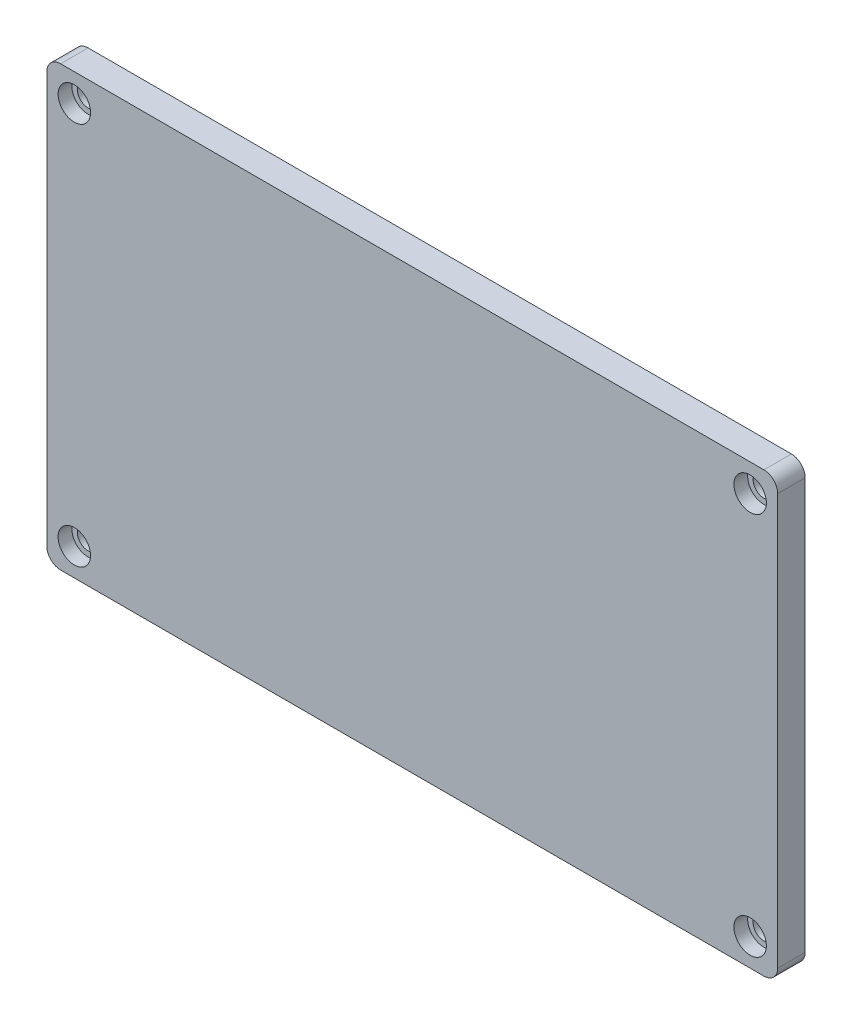
ISO-10303-21;
HEADER;
FILE_DESCRIPTION(('STEP AP214'),'2;1');
FILE_NAME('part.step','',(''),(''),'','','');
FILE_SCHEMA(('AUTOMOTIVE_DESIGN { 1 0 10303 214 1 1 1 1 }'));
ENDSEC;
DATA;
#1=APPLICATION_CONTEXT('core data for automotive mechanical design processes');
#2=APPLICATION_PROTOCOL_DEFINITION('international standard','automotive_design',2000,#1);
#3=PRODUCT_CONTEXT('',#1,'mechanical');
#4=PRODUCT('Part','Part','',(#3));
#5=PRODUCT_RELATED_PRODUCT_CATEGORY('part','',(#4));
#6=PRODUCT_DEFINITION_FORMATION('','',#4);
#7=PRODUCT_DEFINITION_CONTEXT('part definition',#1,'design');
#8=PRODUCT_DEFINITION('design','',#6,#7);
#9=PRODUCT_DEFINITION_SHAPE('','',#8);
#10=(LENGTH_UNIT() NAMED_UNIT(*) SI_UNIT(.MILLI.,.METRE.));
#11=(NAMED_UNIT(*) PLANE_ANGLE_UNIT() SI_UNIT($,.RADIAN.));
#12=(NAMED_UNIT(*) SI_UNIT($,.STERADIAN.) SOLID_ANGLE_UNIT());
#13=UNCERTAINTY_MEASURE_WITH_UNIT(LENGTH_MEASURE(1.E-05),#10,'distance_accuracy_value','');
#14=(GEOMETRIC_REPRESENTATION_CONTEXT(3) GLOBAL_UNCERTAINTY_ASSIGNED_CONTEXT((#13)) GLOBAL_UNIT_ASSIGNED_CONTEXT((#10,
#11,#12)) REPRESENTATION_CONTEXT('',''));
#15=CARTESIAN_POINT('',(0.,0.,0.));
#16=DIRECTION('',(0.,0.,1.));
#17=DIRECTION('',(1.,0.,0.));
#18=AXIS2_PLACEMENT_3D('',#15,#16,#17);
#19=CARTESIAN_POINT('',(0.,0.,2.54));
#20=DIRECTION('',(0.,0.,1.));
#21=DIRECTION('',(1.,0.,0.));
#22=AXIS2_PLACEMENT_3D('',#19,#20,#21);
#23=PLANE('',#22);
#24=CARTESIAN_POINT('',(-66.8216254108451,-3.15196294472563,2.54));
#25=DIRECTION('',(0.,0.,1.));
#26=DIRECTION('',(1.,0.,0.));
#27=AXIS2_PLACEMENT_3D('',#24,#25,#26);
#28=CIRCLE('',#27,2.);
#29=CARTESIAN_POINT('',(-64.8216254108451,-3.15196294472563,2.54));
#30=VERTEX_POINT('',#29);
#31=EDGE_CURVE('E162',#30,#30,#28,.T.);
#32=ORIENTED_EDGE('',*,*,#31,.F.);
#33=EDGE_LOOP('',(#32));
#34=FACE_BOUND('',#33,.T.);
#35=CARTESIAN_POINT('',(-66.8216254108451,-3.15196294472563,2.54));
#36=DIRECTION('',(0.,0.,1.));
#37=DIRECTION('',(1.,0.,0.));
#38=AXIS2_PLACEMENT_3D('',#35,#36,#37);
#39=CIRCLE('',#38,3.00000000000001);
#40=CARTESIAN_POINT('',(-63.8216254108451,-3.15196294472563,2.54));
#41=VERTEX_POINT('',#40);
#42=EDGE_CURVE('E149',#41,#41,#39,.T.);
#43=ORIENTED_EDGE('',*,*,#42,.T.);
#44=EDGE_LOOP('',(#43));
#45=FACE_BOUND('',#44,.T.);
#46=ADVANCED_FACE('F41',(#34,#45),#23,.T.);
#47=CARTESIAN_POINT('',(58.0183745891549,-3.15196294472565,2.54));
#48=DIRECTION('',(0.,0.,1.));
#49=DIRECTION('',(1.,0.,0.));
#50=AXIS2_PLACEMENT_3D('',#47,#48,#49);
#51=CIRCLE('',#50,2.);
#52=CARTESIAN_POINT('',(60.0183745891549,-3.15196294472565,2.54));
#53=VERTEX_POINT('',#52);
#54=EDGE_CURVE('E169',#53,#53,#51,.T.);
#55=ORIENTED_EDGE('',*,*,#54,.F.);
#56=EDGE_LOOP('',(#55));
#57=FACE_BOUND('',#56,.T.);
#58=CARTESIAN_POINT('',(58.0183745891549,-3.15196294472565,2.54));
#59=DIRECTION('',(0.,0.,1.));
#60=DIRECTION('',(1.,0.,0.));
#61=AXIS2_PLACEMENT_3D('',#58,#59,#60);
#62=CIRCLE('',#61,3.00000000000001);
#63=CARTESIAN_POINT('',(61.0183745891549,-3.15196294472565,2.54));
#64=VERTEX_POINT('',#63);
#65=EDGE_CURVE('E152',#64,#64,#62,.T.);
#66=ORIENTED_EDGE('',*,*,#65,.T.);
#67=EDGE_LOOP('',(#66));
#68=FACE_BOUND('',#67,.T.);
#69=ADVANCED_FACE('F244',(#57,#68),#23,.T.);
#70=CARTESIAN_POINT('',(-66.8216254108451,67.6880370552744,2.54));
#71=DIRECTION('',(0.,0.,1.));
#72=DIRECTION('',(1.,0.,0.));
#73=AXIS2_PLACEMENT_3D('',#70,#71,#72);
#74=CIRCLE('',#73,2.);
#75=CARTESIAN_POINT('',(-64.8216254108451,67.6880370552744,2.54));
#76=VERTEX_POINT('',#75);
#77=EDGE_CURVE('E165',#76,#76,#74,.T.);
#78=ORIENTED_EDGE('',*,*,#77,.F.);
#79=EDGE_LOOP('',(#78));
#80=FACE_BOUND('',#79,.T.);
#81=CARTESIAN_POINT('',(-66.8216254108451,67.6880370552744,2.54));
#82=DIRECTION('',(0.,0.,1.));
#83=DIRECTION('',(1.,0.,0.));
#84=AXIS2_PLACEMENT_3D('',#81,#82,#83);
#85=CIRCLE('',#84,3.00000000000001);
#86=CARTESIAN_POINT('',(-63.8216254108451,67.6880370552744,2.54));
#87=VERTEX_POINT('',#86);
#88=EDGE_CURVE('E155',#87,#87,#85,.T.);
#89=ORIENTED_EDGE('',*,*,#88,.T.);
#90=EDGE_LOOP('',(#89));
#91=FACE_BOUND('',#90,.T.);
#92=ADVANCED_FACE('F251',(#80,#91),#23,.T.);
#93=CARTESIAN_POINT('',(58.0183745891549,67.6880370552743,2.54));
#94=DIRECTION('',(0.,0.,1.));
#95=DIRECTION('',(1.,0.,0.));
#96=AXIS2_PLACEMENT_3D('',#93,#94,#95);
#97=CIRCLE('',#96,2.);
#98=CARTESIAN_POINT('',(60.0183745891549,67.6880370552743,2.54));
#99=VERTEX_POINT('',#98);
#100=EDGE_CURVE('E114',#99,#99,#97,.T.);
#101=ORIENTED_EDGE('',*,*,#100,.F.);
#102=EDGE_LOOP('',(#101));
#103=FACE_BOUND('',#102,.T.);
#104=CARTESIAN_POINT('',(58.0183745891549,67.6880370552743,2.54));
#105=DIRECTION('',(0.,0.,1.));
#106=DIRECTION('',(1.,0.,0.));
#107=AXIS2_PLACEMENT_3D('',#104,#105,#106);
#108=CIRCLE('',#107,3.00000000000001);
#109=CARTESIAN_POINT('',(61.0183745891549,67.6880370552743,2.54));
#110=VERTEX_POINT('',#109);
#111=EDGE_CURVE('E158',#110,#110,#108,.T.);
#112=ORIENTED_EDGE('',*,*,#111,.T.);
#113=EDGE_LOOP('',(#112));
#114=FACE_BOUND('',#113,.T.);
#115=ADVANCED_FACE('F247',(#103,#114),#23,.T.);
#116=CARTESIAN_POINT('',(-69.3616254108451,70.2280370552744,2.54));
#117=DIRECTION('',(0.,0.,-1.));
#118=DIRECTION('',(-1.,0.,0.));
#119=AXIS2_PLACEMENT_3D('',#116,#117,#118);
#120=CYLINDRICAL_SURFACE('',#119,2.54);
#121=CARTESIAN_POINT('',(-69.3616254108451,70.2280370552744,0.));
#122=DIRECTION('',(0.,0.,1.));
#123=DIRECTION('',(1.,0.,0.));
#124=AXIS2_PLACEMENT_3D('',#121,#122,#123);
#125=CIRCLE('',#124,2.54);
#126=CARTESIAN_POINT('',(-69.3616254108451,72.7680370552744,0.));
#127=VERTEX_POINT('',#126);
#128=CARTESIAN_POINT('',(-71.9016254108451,70.2280370552744,0.));
#129=VERTEX_POINT('',#128);
#130=EDGE_CURVE('E148',#127,#129,#125,.T.);
#131=ORIENTED_EDGE('',*,*,#130,.T.);
#132=DIRECTION('',(0.,0.,-1.));
#133=VECTOR('',#132,1.);
#134=CARTESIAN_POINT('',(-71.9016254108451,70.2280370552744,2.54));
#135=LINE('',#134,#133);
#136=CARTESIAN_POINT('',(-71.9016254108451,70.2280370552744,5.08));
#137=VERTEX_POINT('',#136);
#138=EDGE_CURVE('E11',#137,#129,#135,.T.);
#139=ORIENTED_EDGE('',*,*,#138,.F.);
#140=CARTESIAN_POINT('',(-69.3616254108451,70.2280370552744,5.08));
#141=DIRECTION('',(0.,0.,1.));
#142=DIRECTION('',(1.,0.,0.));
#143=AXIS2_PLACEMENT_3D('',#140,#141,#142);
#144=CIRCLE('',#143,2.54);
#145=CARTESIAN_POINT('',(-69.3616254108451,72.7680370552744,5.08));
#146=VERTEX_POINT('',#145);
#147=EDGE_CURVE('E117',#146,#137,#144,.T.);
#148=ORIENTED_EDGE('',*,*,#147,.F.);
#149=DIRECTION('',(0.,0.,-1.));
#150=VECTOR('',#149,1.);
#151=CARTESIAN_POINT('',(-69.3616254108451,72.7680370552744,2.54));
#152=LINE('',#151,#150);
#153=EDGE_CURVE('E105',#146,#127,#152,.T.);
#154=ORIENTED_EDGE('',*,*,#153,.T.);
#155=EDGE_LOOP('',(#131,#139,#148,#154));
#156=FACE_BOUND('',#155,.T.);
#157=ADVANCED_FACE('F43',(#156),#120,.T.);
#158=CARTESIAN_POINT('',(-71.9016254108452,0.,2.54));
#159=DIRECTION('',(1.,0.,0.));
#160=DIRECTION('',(0.,1.,0.));
#161=AXIS2_PLACEMENT_3D('',#158,#159,#160);
#162=PLANE('',#161);
#163=DIRECTION('',(0.,-1.,0.));
#164=VECTOR('',#163,1.);
#165=CARTESIAN_POINT('',(-71.9016254108452,0.,0.));
#166=LINE('',#165,#164);
#167=CARTESIAN_POINT('',(-71.9016254108452,-5.69196294472563,0.));
#168=VERTEX_POINT('',#167);
#169=EDGE_CURVE('E175',#129,#168,#166,.T.);
#170=ORIENTED_EDGE('',*,*,#169,.T.);
#171=DIRECTION('',(0.,0.,-1.));
#172=VECTOR('',#171,1.);
#173=CARTESIAN_POINT('',(-71.9016254108452,-5.69196294472563,2.54));
#174=LINE('',#173,#172);
#175=CARTESIAN_POINT('',(-71.9016254108452,-5.69196294472563,5.08));
#176=VERTEX_POINT('',#175);
#177=EDGE_CURVE('E49',#176,#168,#174,.T.);
#178=ORIENTED_EDGE('',*,*,#177,.F.);
#179=DIRECTION('',(0.,-1.,0.));
#180=VECTOR('',#179,1.);
#181=CARTESIAN_POINT('',(-71.9016254108452,0.,5.08));
#182=LINE('',#181,#180);
#183=EDGE_CURVE('E121',#137,#176,#182,.T.);
#184=ORIENTED_EDGE('',*,*,#183,.F.);
#185=ORIENTED_EDGE('',*,*,#138,.T.);
#186=EDGE_LOOP('',(#170,#178,#184,#185));
#187=FACE_BOUND('',#186,.T.);
#188=ADVANCED_FACE('F263',(#187),#162,.F.);
#189=CARTESIAN_POINT('',(-69.3616254108452,-5.69196294472563,2.54));
#190=DIRECTION('',(0.,0.,-1.));
#191=DIRECTION('',(-1.,0.,0.));
#192=AXIS2_PLACEMENT_3D('',#189,#190,#191);
#193=CYLINDRICAL_SURFACE('',#192,2.54);
#194=CARTESIAN_POINT('',(-69.3616254108452,-5.69196294472563,0.));
#195=DIRECTION('',(0.,0.,1.));
#196=DIRECTION('',(1.,0.,0.));
#197=AXIS2_PLACEMENT_3D('',#194,#195,#196);
#198=CIRCLE('',#197,2.54);
#199=CARTESIAN_POINT('',(-69.3616254108452,-8.23196294472563,0.));
#200=VERTEX_POINT('',#199);
#201=EDGE_CURVE('E177',#168,#200,#198,.T.);
#202=ORIENTED_EDGE('',*,*,#201,.T.);
#203=DIRECTION('',(0.,0.,-1.));
#204=VECTOR('',#203,1.);
#205=CARTESIAN_POINT('',(-69.3616254108452,-8.23196294472563,2.54));
#206=LINE('',#205,#204);
#207=CARTESIAN_POINT('',(-69.3616254108452,-8.23196294472563,5.08));
#208=VERTEX_POINT('',#207);
#209=EDGE_CURVE('E207',#208,#200,#206,.T.);
#210=ORIENTED_EDGE('',*,*,#209,.F.);
#211=CARTESIAN_POINT('',(-69.3616254108452,-5.69196294472563,5.08));
#212=DIRECTION('',(0.,0.,1.));
#213=DIRECTION('',(1.,0.,0.));
#214=AXIS2_PLACEMENT_3D('',#211,#212,#213);
#215=CIRCLE('',#214,2.54);
#216=EDGE_CURVE('E136',#176,#208,#215,.T.);
#217=ORIENTED_EDGE('',*,*,#216,.F.);
#218=ORIENTED_EDGE('',*,*,#177,.T.);
#219=EDGE_LOOP('',(#202,#210,#217,#218));
#220=FACE_BOUND('',#219,.T.);
#221=ADVANCED_FACE('F213',(#220),#193,.T.);
#222=CARTESIAN_POINT('',(0.,-8.23196294472564,2.54));
#223=DIRECTION('',(0.,1.,0.));
#224=DIRECTION('',(-1.,0.,0.));
#225=AXIS2_PLACEMENT_3D('',#222,#223,#224);
#226=PLANE('',#225);
#227=DIRECTION('',(1.,0.,0.));
#228=VECTOR('',#227,1.);
#229=CARTESIAN_POINT('',(0.,-8.23196294472564,0.));
#230=LINE('',#229,#228);
#231=CARTESIAN_POINT('',(60.5583745891548,-8.23196294472565,0.));
#232=VERTEX_POINT('',#231);
#233=EDGE_CURVE('E179',#200,#232,#230,.T.);
#234=ORIENTED_EDGE('',*,*,#233,.T.);
#235=DIRECTION('',(0.,0.,-1.));
#236=VECTOR('',#235,1.);
#237=CARTESIAN_POINT('',(60.5583745891548,-8.23196294472565,2.54));
#238=LINE('',#237,#236);
#239=CARTESIAN_POINT('',(60.5583745891548,-8.23196294472566,5.08));
#240=VERTEX_POINT('',#239);
#241=EDGE_CURVE('E204',#240,#232,#238,.T.);
#242=ORIENTED_EDGE('',*,*,#241,.F.);
#243=DIRECTION('',(1.,0.,0.));
#244=VECTOR('',#243,1.);
#245=CARTESIAN_POINT('',(0.,-8.23196294472564,5.08));
#246=LINE('',#245,#244);
#247=EDGE_CURVE('E139',#208,#240,#246,.T.);
#248=ORIENTED_EDGE('',*,*,#247,.F.);
#249=ORIENTED_EDGE('',*,*,#209,.T.);
#250=EDGE_LOOP('',(#234,#242,#248,#249));
#251=FACE_BOUND('',#250,.T.);
#252=ADVANCED_FACE('F222',(#251),#226,.F.);
#253=CARTESIAN_POINT('',(60.5583745891548,-5.69196294472565,2.54));
#254=DIRECTION('',(0.,0.,-1.));
#255=DIRECTION('',(-1.,0.,0.));
#256=AXIS2_PLACEMENT_3D('',#253,#254,#255);
#257=CYLINDRICAL_SURFACE('',#256,2.54000000000001);
#258=CARTESIAN_POINT('',(60.5583745891548,-5.69196294472565,0.));
#259=DIRECTION('',(0.,0.,1.));
#260=DIRECTION('',(1.,0.,0.));
#261=AXIS2_PLACEMENT_3D('',#258,#259,#260);
#262=CIRCLE('',#261,2.54000000000001);
#263=CARTESIAN_POINT('',(63.0983745891549,-5.69196294472565,0.));
#264=VERTEX_POINT('',#263);
#265=EDGE_CURVE('E181',#232,#264,#262,.T.);
#266=ORIENTED_EDGE('',*,*,#265,.T.);
#267=DIRECTION('',(0.,0.,-1.));
#268=VECTOR('',#267,1.);
#269=CARTESIAN_POINT('',(63.0983745891549,-5.69196294472565,2.54));
#270=LINE('',#269,#268);
#271=CARTESIAN_POINT('',(63.0983745891549,-5.69196294472565,5.08));
#272=VERTEX_POINT('',#271);
#273=EDGE_CURVE('E201',#272,#264,#270,.T.);
#274=ORIENTED_EDGE('',*,*,#273,.F.);
#275=CARTESIAN_POINT('',(60.5583745891548,-5.69196294472565,5.08));
#276=DIRECTION('',(0.,0.,1.));
#277=DIRECTION('',(1.,0.,0.));
#278=AXIS2_PLACEMENT_3D('',#275,#276,#277);
#279=CIRCLE('',#278,2.54000000000001);
#280=EDGE_CURVE('E142',#240,#272,#279,.T.);
#281=ORIENTED_EDGE('',*,*,#280,.F.);
#282=ORIENTED_EDGE('',*,*,#241,.T.);
#283=EDGE_LOOP('',(#266,#274,#281,#282));
#284=FACE_BOUND('',#283,.T.);
#285=ADVANCED_FACE('F226',(#284),#257,.T.);
#286=CARTESIAN_POINT('',(63.0983745891549,0.,2.54));
#287=DIRECTION('',(-1.,0.,0.));
#288=DIRECTION('',(0.,-1.,0.));
#289=AXIS2_PLACEMENT_3D('',#286,#287,#288);
#290=PLANE('',#289);
#291=DIRECTION('',(0.,1.,0.));
#292=VECTOR('',#291,1.);
#293=CARTESIAN_POINT('',(63.0983745891549,0.,0.));
#294=LINE('',#293,#292);
#295=CARTESIAN_POINT('',(63.0983745891549,70.2280370552743,0.));
#296=VERTEX_POINT('',#295);
#297=EDGE_CURVE('E183',#264,#296,#294,.T.);
#298=ORIENTED_EDGE('',*,*,#297,.T.);
#299=DIRECTION('',(0.,0.,-1.));
#300=VECTOR('',#299,1.);
#301=CARTESIAN_POINT('',(63.0983745891549,70.2280370552743,2.54));
#302=LINE('',#301,#300);
#303=CARTESIAN_POINT('',(63.0983745891549,70.2280370552743,5.08));
#304=VERTEX_POINT('',#303);
#305=EDGE_CURVE('E199',#304,#296,#302,.T.);
#306=ORIENTED_EDGE('',*,*,#305,.F.);
#307=DIRECTION('',(0.,1.,0.));
#308=VECTOR('',#307,1.);
#309=CARTESIAN_POINT('',(63.0983745891549,0.,5.08));
#310=LINE('',#309,#308);
#311=EDGE_CURVE('E145',#272,#304,#310,.T.);
#312=ORIENTED_EDGE('',*,*,#311,.F.);
#313=ORIENTED_EDGE('',*,*,#273,.T.);
#314=EDGE_LOOP('',(#298,#306,#312,#313));
#315=FACE_BOUND('',#314,.T.);
#316=ADVANCED_FACE('F229',(#315),#290,.F.);
#317=CARTESIAN_POINT('',(60.5583745891549,70.2280370552743,2.54));
#318=DIRECTION('',(0.,0.,-1.));
#319=DIRECTION('',(-1.,0.,0.));
#320=AXIS2_PLACEMENT_3D('',#317,#318,#319);
#321=CYLINDRICAL_SURFACE('',#320,2.54);
#322=CARTESIAN_POINT('',(60.5583745891549,70.2280370552743,0.));
#323=DIRECTION('',(0.,0.,1.));
#324=DIRECTION('',(1.,0.,0.));
#325=AXIS2_PLACEMENT_3D('',#322,#323,#324);
#326=CIRCLE('',#325,2.54);
#327=CARTESIAN_POINT('',(60.5583745891549,72.7680370552743,0.));
#328=VERTEX_POINT('',#327);
#329=EDGE_CURVE('E64',#296,#328,#326,.T.);
#330=ORIENTED_EDGE('',*,*,#329,.T.);
#331=DIRECTION('',(0.,0.,-1.));
#332=VECTOR('',#331,1.);
#333=CARTESIAN_POINT('',(60.5583745891549,72.7680370552743,2.54));
#334=LINE('',#333,#332);
#335=CARTESIAN_POINT('',(60.5583745891549,72.7680370552743,5.08));
#336=VERTEX_POINT('',#335);
#337=EDGE_CURVE('E113',#336,#328,#334,.T.);
#338=ORIENTED_EDGE('',*,*,#337,.F.);
#339=CARTESIAN_POINT('',(60.5583745891549,70.2280370552743,5.08));
#340=DIRECTION('',(0.,0.,1.));
#341=DIRECTION('',(1.,0.,0.));
#342=AXIS2_PLACEMENT_3D('',#339,#340,#341);
#343=CIRCLE('',#342,2.54);
#344=EDGE_CURVE('E127',#304,#336,#343,.T.);
#345=ORIENTED_EDGE('',*,*,#344,.F.);
#346=ORIENTED_EDGE('',*,*,#305,.T.);
#347=EDGE_LOOP('',(#330,#338,#345,#346));
#348=FACE_BOUND('',#347,.T.);
#349=ADVANCED_FACE('F230',(#348),#321,.T.);
#350=CARTESIAN_POINT('',(58.0183745891549,-3.15196294472565,2.54));
#351=DIRECTION('',(0.,0.,-1.));
#352=DIRECTION('',(-1.,0.,0.));
#353=AXIS2_PLACEMENT_3D('',#350,#351,#352);
#354=CYLINDRICAL_SURFACE('',#353,2.);
#355=ORIENTED_EDGE('',*,*,#54,.T.);
#356=EDGE_LOOP('',(#355));
#357=FACE_BOUND('',#356,.T.);
#358=CARTESIAN_POINT('',(58.0183745891549,-3.15196294472565,0.));
#359=DIRECTION('',(0.,0.,1.));
#360=DIRECTION('',(1.,0.,0.));
#361=AXIS2_PLACEMENT_3D('',#358,#359,#360);
#362=CIRCLE('',#361,2.);
#363=CARTESIAN_POINT('',(60.0183745891549,-3.15196294472565,0.));
#364=VERTEX_POINT('',#363);
#365=EDGE_CURVE('E193',#364,#364,#362,.T.);
#366=ORIENTED_EDGE('',*,*,#365,.F.);
#367=EDGE_LOOP('',(#366));
#368=FACE_BOUND('',#367,.T.);
#369=ADVANCED_FACE('F232',(#357,#368),#354,.F.);
#370=CARTESIAN_POINT('',(-66.8216254108451,67.6880370552744,2.54));
#371=DIRECTION('',(0.,0.,-1.));
#372=DIRECTION('',(-1.,0.,0.));
#373=AXIS2_PLACEMENT_3D('',#370,#371,#372);
#374=CYLINDRICAL_SURFACE('',#373,2.);
#375=ORIENTED_EDGE('',*,*,#77,.T.);
#376=EDGE_LOOP('',(#375));
#377=FACE_BOUND('',#376,.T.);
#378=CARTESIAN_POINT('',(-66.8216254108451,67.6880370552744,0.));
#379=DIRECTION('',(0.,0.,1.));
#380=DIRECTION('',(1.,0.,0.));
#381=AXIS2_PLACEMENT_3D('',#378,#379,#380);
#382=CIRCLE('',#381,2.);
#383=CARTESIAN_POINT('',(-64.8216254108451,67.6880370552744,0.));
#384=VERTEX_POINT('',#383);
#385=EDGE_CURVE('E190',#384,#384,#382,.T.);
#386=ORIENTED_EDGE('',*,*,#385,.F.);
#387=EDGE_LOOP('',(#386));
#388=FACE_BOUND('',#387,.T.);
#389=ADVANCED_FACE('F238',(#377,#388),#374,.F.);
#390=CARTESIAN_POINT('',(-66.8216254108451,-3.15196294472563,2.54));
#391=DIRECTION('',(0.,0.,-1.));
#392=DIRECTION('',(-1.,0.,0.));
#393=AXIS2_PLACEMENT_3D('',#390,#391,#392);
#394=CYLINDRICAL_SURFACE('',#393,2.);
#395=ORIENTED_EDGE('',*,*,#31,.T.);
#396=EDGE_LOOP('',(#395));
#397=FACE_BOUND('',#396,.T.);
#398=CARTESIAN_POINT('',(-66.8216254108451,-3.15196294472563,0.));
#399=DIRECTION('',(0.,0.,1.));
#400=DIRECTION('',(1.,0.,0.));
#401=AXIS2_PLACEMENT_3D('',#398,#399,#400);
#402=CIRCLE('',#401,2.);
#403=CARTESIAN_POINT('',(-64.8216254108451,-3.15196294472563,0.));
#404=VERTEX_POINT('',#403);
#405=EDGE_CURVE('E187',#404,#404,#402,.T.);
#406=ORIENTED_EDGE('',*,*,#405,.F.);
#407=EDGE_LOOP('',(#406));
#408=FACE_BOUND('',#407,.T.);
#409=ADVANCED_FACE('F349',(#397,#408),#394,.F.);
#410=CARTESIAN_POINT('',(0.,72.7680370552744,2.54));
#411=DIRECTION('',(0.,-1.,0.));
#412=DIRECTION('',(1.,0.,0.));
#413=AXIS2_PLACEMENT_3D('',#410,#411,#412);
#414=PLANE('',#413);
#415=DIRECTION('',(-1.,0.,0.));
#416=VECTOR('',#415,1.);
#417=CARTESIAN_POINT('',(0.,72.7680370552744,0.));
#418=LINE('',#417,#416);
#419=EDGE_CURVE('E56',#328,#127,#418,.T.);
#420=ORIENTED_EDGE('',*,*,#419,.T.);
#421=ORIENTED_EDGE('',*,*,#153,.F.);
#422=DIRECTION('',(-1.,0.,0.));
#423=VECTOR('',#422,1.);
#424=CARTESIAN_POINT('',(0.,72.7680370552744,5.08));
#425=LINE('',#424,#423);
#426=EDGE_CURVE('E109',#336,#146,#425,.T.);
#427=ORIENTED_EDGE('',*,*,#426,.F.);
#428=ORIENTED_EDGE('',*,*,#337,.T.);
#429=EDGE_LOOP('',(#420,#421,#427,#428));
#430=FACE_BOUND('',#429,.T.);
#431=ADVANCED_FACE('F107',(#430),#414,.F.);
#432=CARTESIAN_POINT('',(58.0183745891549,67.6880370552743,2.54));
#433=DIRECTION('',(0.,0.,-1.));
#434=DIRECTION('',(-1.,0.,0.));
#435=AXIS2_PLACEMENT_3D('',#432,#433,#434);
#436=CYLINDRICAL_SURFACE('',#435,2.);
#437=ORIENTED_EDGE('',*,*,#100,.T.);
#438=EDGE_LOOP('',(#437));
#439=FACE_BOUND('',#438,.T.);
#440=CARTESIAN_POINT('',(58.0183745891549,67.6880370552743,0.));
#441=DIRECTION('',(0.,0.,1.));
#442=DIRECTION('',(1.,0.,0.));
#443=AXIS2_PLACEMENT_3D('',#440,#441,#442);
#444=CIRCLE('',#443,2.);
#445=CARTESIAN_POINT('',(60.0183745891549,67.6880370552743,0.));
#446=VERTEX_POINT('',#445);
#447=EDGE_CURVE('E166',#446,#446,#444,.T.);
#448=ORIENTED_EDGE('',*,*,#447,.F.);
#449=EDGE_LOOP('',(#448));
#450=FACE_BOUND('',#449,.T.);
#451=ADVANCED_FACE('F281',(#439,#450),#436,.F.);
#452=CARTESIAN_POINT('',(0.,0.,0.));
#453=DIRECTION('',(0.,0.,1.));
#454=DIRECTION('',(1.,0.,0.));
#455=AXIS2_PLACEMENT_3D('',#452,#453,#454);
#456=PLANE('',#455);
#457=ORIENTED_EDGE('',*,*,#130,.F.);
#458=ORIENTED_EDGE('',*,*,#419,.F.);
#459=ORIENTED_EDGE('',*,*,#329,.F.);
#460=ORIENTED_EDGE('',*,*,#297,.F.);
#461=ORIENTED_EDGE('',*,*,#265,.F.);
#462=ORIENTED_EDGE('',*,*,#233,.F.);
#463=ORIENTED_EDGE('',*,*,#201,.F.);
#464=ORIENTED_EDGE('',*,*,#169,.F.);
#465=EDGE_LOOP('',(#457,#458,#459,#460,#461,#462,#463,#464));
#466=FACE_BOUND('',#465,.T.);
#467=ORIENTED_EDGE('',*,*,#405,.T.);
#468=EDGE_LOOP('',(#467));
#469=FACE_BOUND('',#468,.T.);
#470=ORIENTED_EDGE('',*,*,#385,.T.);
#471=EDGE_LOOP('',(#470));
#472=FACE_BOUND('',#471,.T.);
#473=ORIENTED_EDGE('',*,*,#365,.T.);
#474=EDGE_LOOP('',(#473));
#475=FACE_BOUND('',#474,.T.);
#476=ORIENTED_EDGE('',*,*,#447,.T.);
#477=EDGE_LOOP('',(#476));
#478=FACE_BOUND('',#477,.T.);
#479=ADVANCED_FACE('F217',(#466,#469,#472,#475,#478),#456,.F.);
#480=CARTESIAN_POINT('',(58.0183745891549,67.6880370552743,5.08));
#481=DIRECTION('',(0.,0.,-1.));
#482=DIRECTION('',(-1.,0.,0.));
#483=AXIS2_PLACEMENT_3D('',#480,#481,#482);
#484=CYLINDRICAL_SURFACE('',#483,3.00000000000001);
#485=CARTESIAN_POINT('',(58.0183745891549,67.6880370552743,5.08));
#486=DIRECTION('',(0.,0.,1.));
#487=DIRECTION('',(1.,0.,0.));
#488=AXIS2_PLACEMENT_3D('',#485,#486,#487);
#489=CIRCLE('',#488,3.00000000000001);
#490=CARTESIAN_POINT('',(61.0183745891549,67.6880370552743,5.08));
#491=VERTEX_POINT('',#490);
#492=EDGE_CURVE('E128',#491,#491,#489,.T.);
#493=ORIENTED_EDGE('',*,*,#492,.T.);
#494=EDGE_LOOP('',(#493));
#495=FACE_BOUND('',#494,.T.);
#496=ORIENTED_EDGE('',*,*,#111,.F.);
#497=EDGE_LOOP('',(#496));
#498=FACE_BOUND('',#497,.T.);
#499=ADVANCED_FACE('F269',(#495,#498),#484,.F.);
#500=CARTESIAN_POINT('',(-66.8216254108451,67.6880370552744,5.08));
#501=DIRECTION('',(0.,0.,-1.));
#502=DIRECTION('',(-1.,0.,0.));
#503=AXIS2_PLACEMENT_3D('',#500,#501,#502);
#504=CYLINDRICAL_SURFACE('',#503,3.00000000000001);
#505=CARTESIAN_POINT('',(-66.8216254108451,67.6880370552744,5.08));
#506=DIRECTION('',(0.,0.,1.));
#507=DIRECTION('',(1.,0.,0.));
#508=AXIS2_PLACEMENT_3D('',#505,#506,#507);
#509=CIRCLE('',#508,3.00000000000001);
#510=CARTESIAN_POINT('',(-63.8216254108451,67.6880370552744,5.08));
#511=VERTEX_POINT('',#510);
#512=EDGE_CURVE('E131',#511,#511,#509,.T.);
#513=ORIENTED_EDGE('',*,*,#512,.T.);
#514=EDGE_LOOP('',(#513));
#515=FACE_BOUND('',#514,.T.);
#516=ORIENTED_EDGE('',*,*,#88,.F.);
#517=EDGE_LOOP('',(#516));
#518=FACE_BOUND('',#517,.T.);
#519=ADVANCED_FACE('F271',(#515,#518),#504,.F.);
#520=CARTESIAN_POINT('',(58.0183745891549,-3.15196294472565,5.08));
#521=DIRECTION('',(0.,0.,-1.));
#522=DIRECTION('',(-1.,0.,0.));
#523=AXIS2_PLACEMENT_3D('',#520,#521,#522);
#524=CYLINDRICAL_SURFACE('',#523,3.00000000000001);
#525=CARTESIAN_POINT('',(58.0183745891549,-3.15196294472565,5.08));
#526=DIRECTION('',(0.,0.,1.));
#527=DIRECTION('',(1.,0.,0.));
#528=AXIS2_PLACEMENT_3D('',#525,#526,#527);
#529=CIRCLE('',#528,3.00000000000001);
#530=CARTESIAN_POINT('',(61.0183745891549,-3.15196294472565,5.08));
#531=VERTEX_POINT('',#530);
#532=EDGE_CURVE('E297',#531,#531,#529,.T.);
#533=ORIENTED_EDGE('',*,*,#532,.T.);
#534=EDGE_LOOP('',(#533));
#535=FACE_BOUND('',#534,.T.);
#536=ORIENTED_EDGE('',*,*,#65,.F.);
#537=EDGE_LOOP('',(#536));
#538=FACE_BOUND('',#537,.T.);
#539=ADVANCED_FACE('F278',(#535,#538),#524,.F.);
#540=CARTESIAN_POINT('',(-66.8216254108451,-3.15196294472563,5.08));
#541=DIRECTION('',(0.,0.,-1.));
#542=DIRECTION('',(-1.,0.,0.));
#543=AXIS2_PLACEMENT_3D('',#540,#541,#542);
#544=CYLINDRICAL_SURFACE('',#543,3.00000000000001);
#545=CARTESIAN_POINT('',(-66.8216254108451,-3.15196294472563,5.08));
#546=DIRECTION('',(0.,0.,1.));
#547=DIRECTION('',(1.,0.,0.));
#548=AXIS2_PLACEMENT_3D('',#545,#546,#547);
#549=CIRCLE('',#548,3.00000000000001);
#550=CARTESIAN_POINT('',(-63.8216254108451,-3.15196294472563,5.08));
#551=VERTEX_POINT('',#550);
#552=EDGE_CURVE('E161',#551,#551,#549,.T.);
#553=ORIENTED_EDGE('',*,*,#552,.T.);
#554=EDGE_LOOP('',(#553));
#555=FACE_BOUND('',#554,.T.);
#556=ORIENTED_EDGE('',*,*,#42,.F.);
#557=EDGE_LOOP('',(#556));
#558=FACE_BOUND('',#557,.T.);
#559=ADVANCED_FACE('F285',(#555,#558),#544,.F.);
#560=CARTESIAN_POINT('',(0.,0.,5.08));
#561=DIRECTION('',(0.,0.,1.));
#562=DIRECTION('',(1.,0.,0.));
#563=AXIS2_PLACEMENT_3D('',#560,#561,#562);
#564=PLANE('',#563);
#565=ORIENTED_EDGE('',*,*,#552,.F.);
#566=EDGE_LOOP('',(#565));
#567=FACE_BOUND('',#566,.T.);
#568=ORIENTED_EDGE('',*,*,#532,.F.);
#569=EDGE_LOOP('',(#568));
#570=FACE_BOUND('',#569,.T.);
#571=ORIENTED_EDGE('',*,*,#512,.F.);
#572=EDGE_LOOP('',(#571));
#573=FACE_BOUND('',#572,.T.);
#574=ORIENTED_EDGE('',*,*,#492,.F.);
#575=EDGE_LOOP('',(#574));
#576=FACE_BOUND('',#575,.T.);
#577=ORIENTED_EDGE('',*,*,#426,.T.);
#578=ORIENTED_EDGE('',*,*,#147,.T.);
#579=ORIENTED_EDGE('',*,*,#183,.T.);
#580=ORIENTED_EDGE('',*,*,#216,.T.);
#581=ORIENTED_EDGE('',*,*,#247,.T.);
#582=ORIENTED_EDGE('',*,*,#280,.T.);
#583=ORIENTED_EDGE('',*,*,#311,.T.);
#584=ORIENTED_EDGE('',*,*,#344,.T.);
#585=EDGE_LOOP('',(#577,#578,#579,#580,#581,#582,#583,#584));
#586=FACE_BOUND('',#585,.T.);
#587=ADVANCED_FACE('F124',(#567,#570,#573,#576,#586),#564,.T.);
#588=CLOSED_SHELL('',(#46,#69,#92,#115,#157,#188,#221,#252,#285,#316,#349,#369,#389,#409,#431,
#451,#479,#499,#519,#539,#559,#587));
#589=MANIFOLD_SOLID_BREP('B2',#588);
#590=ADVANCED_BREP_SHAPE_REPRESENTATION('',(#18,#589),#14);
#591=SHAPE_DEFINITION_REPRESENTATION(#9,#590);
ENDSEC;
END-ISO-10303-21;
